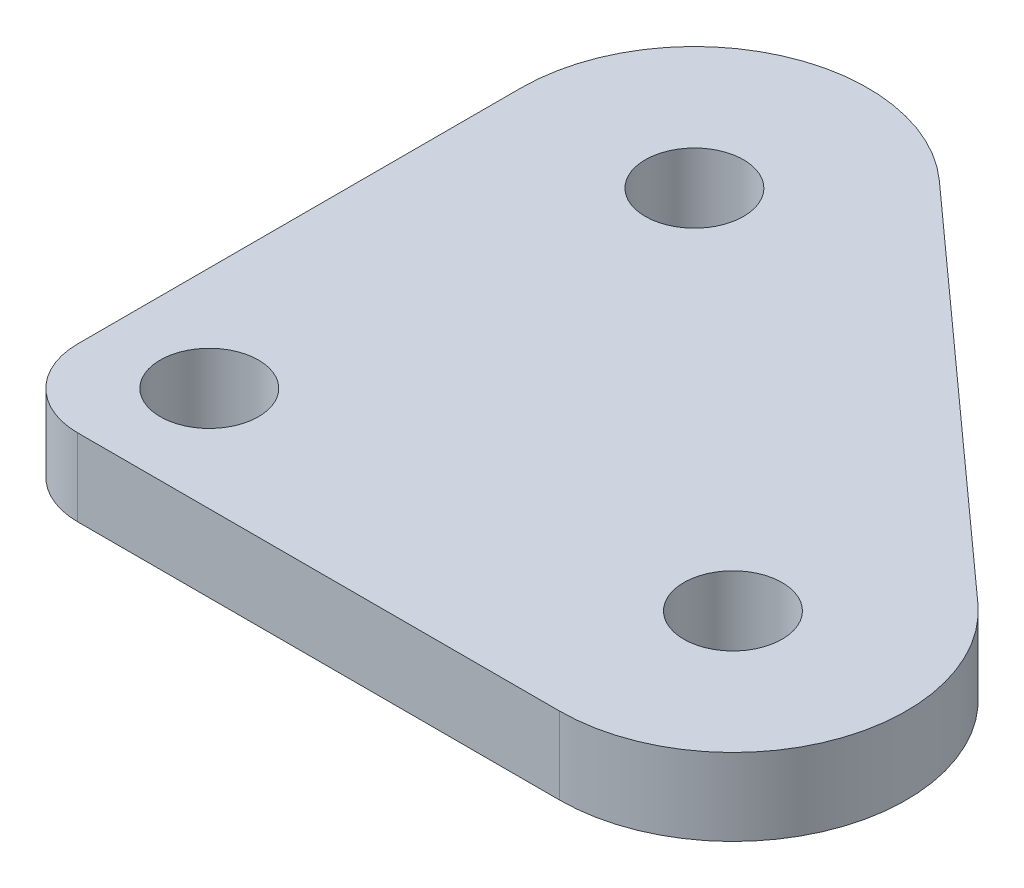
ISO-10303-21;
HEADER;
FILE_DESCRIPTION(('STEP AP214'),'2;1');
FILE_NAME('part.step','',(''),(''),'','','');
FILE_SCHEMA(('AUTOMOTIVE_DESIGN { 1 0 10303 214 1 1 1 1 }'));
ENDSEC;
DATA;
#1=APPLICATION_CONTEXT('core data for automotive mechanical design processes');
#2=APPLICATION_PROTOCOL_DEFINITION('international standard','automotive_design',2000,#1);
#3=PRODUCT_CONTEXT('',#1,'mechanical');
#4=PRODUCT('Part','Part','',(#3));
#5=PRODUCT_RELATED_PRODUCT_CATEGORY('part','',(#4));
#6=PRODUCT_DEFINITION_FORMATION('','',#4);
#7=PRODUCT_DEFINITION_CONTEXT('part definition',#1,'design');
#8=PRODUCT_DEFINITION('design','',#6,#7);
#9=PRODUCT_DEFINITION_SHAPE('','',#8);
#10=(LENGTH_UNIT() NAMED_UNIT(*) SI_UNIT(.MILLI.,.METRE.));
#11=(NAMED_UNIT(*) PLANE_ANGLE_UNIT() SI_UNIT($,.RADIAN.));
#12=(NAMED_UNIT(*) SI_UNIT($,.STERADIAN.) SOLID_ANGLE_UNIT());
#13=UNCERTAINTY_MEASURE_WITH_UNIT(LENGTH_MEASURE(1.E-05),#10,'distance_accuracy_value','');
#14=(GEOMETRIC_REPRESENTATION_CONTEXT(3) GLOBAL_UNCERTAINTY_ASSIGNED_CONTEXT((#13)) GLOBAL_UNIT_ASSIGNED_CONTEXT((#10,
#11,#12)) REPRESENTATION_CONTEXT('',''));
#15=CARTESIAN_POINT('',(0.,0.,0.));
#16=DIRECTION('',(0.,0.,1.));
#17=DIRECTION('',(1.,0.,0.));
#18=AXIS2_PLACEMENT_3D('',#15,#16,#17);
#19=CARTESIAN_POINT('',(20.,4.,0.));
#20=DIRECTION('',(0.,-1.,0.));
#21=DIRECTION('',(0.,0.,-1.));
#22=AXIS2_PLACEMENT_3D('',#19,#20,#21);
#23=CYLINDRICAL_SURFACE('',#22,9.);
#24=CARTESIAN_POINT('',(20.,0.,0.));
#25=DIRECTION('',(0.,1.,0.));
#26=DIRECTION('',(0.,0.,1.));
#27=AXIS2_PLACEMENT_3D('',#24,#25,#26);
#28=CIRCLE('',#27,9.);
#29=CARTESIAN_POINT('',(20.,0.,9.));
#30=VERTEX_POINT('',#29);
#31=CARTESIAN_POINT('',(26.020682584602,0.,-6.6896473162245));
#32=VERTEX_POINT('',#31);
#33=EDGE_CURVE('E107',#30,#32,#28,.T.);
#34=ORIENTED_EDGE('',*,*,#33,.T.);
#35=DIRECTION('',(0.,-1.,0.));
#36=VECTOR('',#35,1.);
#37=CARTESIAN_POINT('',(26.020682584602,4.,-6.6896473162245));
#38=LINE('',#37,#36);
#39=CARTESIAN_POINT('',(26.020682584602,4.,-6.6896473162245));
#40=VERTEX_POINT('',#39);
#41=EDGE_CURVE('E105',#40,#32,#38,.T.);
#42=ORIENTED_EDGE('',*,*,#41,.F.);
#43=CARTESIAN_POINT('',(20.,4.,0.));
#44=DIRECTION('',(0.,1.,0.));
#45=DIRECTION('',(0.,0.,1.));
#46=AXIS2_PLACEMENT_3D('',#43,#44,#45);
#47=CIRCLE('',#46,9.);
#48=CARTESIAN_POINT('',(20.,4.,9.));
#49=VERTEX_POINT('',#48);
#50=EDGE_CURVE('E92',#49,#40,#47,.T.);
#51=ORIENTED_EDGE('',*,*,#50,.F.);
#52=DIRECTION('',(0.,-1.,0.));
#53=VECTOR('',#52,1.);
#54=CARTESIAN_POINT('',(20.,4.,9.));
#55=LINE('',#54,#53);
#56=EDGE_CURVE('E127',#49,#30,#55,.T.);
#57=ORIENTED_EDGE('',*,*,#56,.T.);
#58=EDGE_LOOP('',(#34,#42,#51,#57));
#59=FACE_BOUND('',#58,.T.);
#60=ADVANCED_FACE('F40',(#59),#23,.T.);
#61=CARTESIAN_POINT('',(14.970958827696,4.,-16.63439869744));
#62=DIRECTION('',(0.66896473162245,0.,-0.743294146247166));
#63=DIRECTION('',(-0.743294146247166,0.,-0.66896473162245));
#64=AXIS2_PLACEMENT_3D('',#61,#62,#63);
#65=PLANE('',#64);
#66=DIRECTION('',(0.743294146247166,0.,0.66896473162245));
#67=VECTOR('',#66,1.);
#68=CARTESIAN_POINT('',(14.970958827696,0.,-16.63439869744));
#69=LINE('',#68,#67);
#70=CARTESIAN_POINT('',(6.02068258460205,0.,-24.6896473162245));
#71=VERTEX_POINT('',#70);
#72=EDGE_CURVE('E133',#71,#32,#69,.T.);
#73=ORIENTED_EDGE('',*,*,#72,.F.);
#74=DIRECTION('',(0.,-1.,0.));
#75=VECTOR('',#74,1.);
#76=CARTESIAN_POINT('',(6.02068258460205,4.,-24.6896473162245));
#77=LINE('',#76,#75);
#78=CARTESIAN_POINT('',(6.02068258460205,4.,-24.6896473162245));
#79=VERTEX_POINT('',#78);
#80=EDGE_CURVE('E112',#79,#71,#77,.T.);
#81=ORIENTED_EDGE('',*,*,#80,.F.);
#82=DIRECTION('',(0.743294146247166,0.,0.66896473162245));
#83=VECTOR('',#82,1.);
#84=CARTESIAN_POINT('',(14.970958827696,4.,-16.63439869744));
#85=LINE('',#84,#83);
#86=EDGE_CURVE('E98',#79,#40,#85,.T.);
#87=ORIENTED_EDGE('',*,*,#86,.T.);
#88=ORIENTED_EDGE('',*,*,#41,.T.);
#89=EDGE_LOOP('',(#73,#81,#87,#88));
#90=FACE_BOUND('',#89,.T.);
#91=ADVANCED_FACE('F114',(#90),#65,.T.);
#92=CARTESIAN_POINT('',(0.,4.,-18.));
#93=DIRECTION('',(0.,-1.,0.));
#94=DIRECTION('',(0.,0.,-1.));
#95=AXIS2_PLACEMENT_3D('',#92,#93,#94);
#96=CYLINDRICAL_SURFACE('',#95,9.);
#97=CARTESIAN_POINT('',(0.,0.,-18.));
#98=DIRECTION('',(0.,1.,0.));
#99=DIRECTION('',(0.,0.,1.));
#100=AXIS2_PLACEMENT_3D('',#97,#98,#99);
#101=CIRCLE('',#100,9.);
#102=CARTESIAN_POINT('',(-9.,0.,-18.));
#103=VERTEX_POINT('',#102);
#104=EDGE_CURVE('E135',#71,#103,#101,.T.);
#105=ORIENTED_EDGE('',*,*,#104,.T.);
#106=DIRECTION('',(0.,-1.,0.));
#107=VECTOR('',#106,1.);
#108=CARTESIAN_POINT('',(-9.,4.,-18.));
#109=LINE('',#108,#107);
#110=CARTESIAN_POINT('',(-9.,4.,-18.));
#111=VERTEX_POINT('',#110);
#112=EDGE_CURVE('E146',#111,#103,#109,.T.);
#113=ORIENTED_EDGE('',*,*,#112,.F.);
#114=CARTESIAN_POINT('',(0.,4.,-18.));
#115=DIRECTION('',(0.,1.,0.));
#116=DIRECTION('',(0.,0.,1.));
#117=AXIS2_PLACEMENT_3D('',#114,#115,#116);
#118=CIRCLE('',#117,9.);
#119=EDGE_CURVE('E116',#79,#111,#118,.T.);
#120=ORIENTED_EDGE('',*,*,#119,.F.);
#121=ORIENTED_EDGE('',*,*,#80,.T.);
#122=EDGE_LOOP('',(#105,#113,#120,#121));
#123=FACE_BOUND('',#122,.T.);
#124=ADVANCED_FACE('F163',(#123),#96,.T.);
#125=CARTESIAN_POINT('',(-9.,4.,0.));
#126=DIRECTION('',(-1.,0.,0.));
#127=DIRECTION('',(0.,0.,1.));
#128=AXIS2_PLACEMENT_3D('',#125,#126,#127);
#129=PLANE('',#128);
#130=DIRECTION('',(0.,0.,-1.));
#131=VECTOR('',#130,1.);
#132=CARTESIAN_POINT('',(-9.,0.,0.));
#133=LINE('',#132,#131);
#134=CARTESIAN_POINT('',(-9.,0.,5.));
#135=VERTEX_POINT('',#134);
#136=EDGE_CURVE('E138',#135,#103,#133,.T.);
#137=ORIENTED_EDGE('',*,*,#136,.F.);
#138=DIRECTION('',(0.,-1.,0.));
#139=VECTOR('',#138,1.);
#140=CARTESIAN_POINT('',(-9.,4.,5.));
#141=LINE('',#140,#139);
#142=CARTESIAN_POINT('',(-9.,4.,5.));
#143=VERTEX_POINT('',#142);
#144=EDGE_CURVE('E48',#135,#143,#141,.F.);
#145=ORIENTED_EDGE('',*,*,#144,.T.);
#146=DIRECTION('',(0.,0.,-1.));
#147=VECTOR('',#146,1.);
#148=CARTESIAN_POINT('',(-9.,4.,0.));
#149=LINE('',#148,#147);
#150=EDGE_CURVE('E118',#143,#111,#149,.T.);
#151=ORIENTED_EDGE('',*,*,#150,.T.);
#152=ORIENTED_EDGE('',*,*,#112,.T.);
#153=EDGE_LOOP('',(#137,#145,#151,#152));
#154=FACE_BOUND('',#153,.T.);
#155=ADVANCED_FACE('F191',(#154),#129,.T.);
#156=CARTESIAN_POINT('',(0.,4.,9.));
#157=DIRECTION('',(0.,0.,1.));
#158=DIRECTION('',(1.,0.,0.));
#159=AXIS2_PLACEMENT_3D('',#156,#157,#158);
#160=PLANE('',#159);
#161=DIRECTION('',(-1.,0.,0.));
#162=VECTOR('',#161,1.);
#163=CARTESIAN_POINT('',(0.,4.,9.));
#164=LINE('',#163,#162);
#165=CARTESIAN_POINT('',(-5.,4.,9.));
#166=VERTEX_POINT('',#165);
#167=EDGE_CURVE('E100',#49,#166,#164,.T.);
#168=ORIENTED_EDGE('',*,*,#167,.T.);
#169=DIRECTION('',(0.,-1.,0.));
#170=VECTOR('',#169,1.);
#171=CARTESIAN_POINT('',(-5.,4.,9.));
#172=LINE('',#171,#170);
#173=CARTESIAN_POINT('',(-5.,0.,9.));
#174=VERTEX_POINT('',#173);
#175=EDGE_CURVE('E111',#166,#174,#172,.T.);
#176=ORIENTED_EDGE('',*,*,#175,.T.);
#177=DIRECTION('',(-1.,0.,0.));
#178=VECTOR('',#177,1.);
#179=CARTESIAN_POINT('',(0.,0.,9.));
#180=LINE('',#179,#178);
#181=EDGE_CURVE('E140',#30,#174,#180,.T.);
#182=ORIENTED_EDGE('',*,*,#181,.F.);
#183=ORIENTED_EDGE('',*,*,#56,.F.);
#184=EDGE_LOOP('',(#168,#176,#182,#183));
#185=FACE_BOUND('',#184,.T.);
#186=ADVANCED_FACE('F155',(#185),#160,.T.);
#187=CARTESIAN_POINT('',(20.,4.,0.));
#188=DIRECTION('',(0.,-1.,0.));
#189=DIRECTION('',(0.,0.,-1.));
#190=AXIS2_PLACEMENT_3D('',#187,#188,#189);
#191=CYLINDRICAL_SURFACE('',#190,2.55);
#192=CARTESIAN_POINT('',(20.,4.,0.));
#193=DIRECTION('',(0.,1.,0.));
#194=DIRECTION('',(0.,0.,1.));
#195=AXIS2_PLACEMENT_3D('',#192,#193,#194);
#196=CIRCLE('',#195,2.55);
#197=CARTESIAN_POINT('',(20.,4.,2.55));
#198=VERTEX_POINT('',#197);
#199=EDGE_CURVE('E102',#198,#198,#196,.T.);
#200=ORIENTED_EDGE('',*,*,#199,.T.);
#201=EDGE_LOOP('',(#200));
#202=FACE_BOUND('',#201,.T.);
#203=CARTESIAN_POINT('',(20.,0.,0.));
#204=DIRECTION('',(0.,1.,0.));
#205=DIRECTION('',(0.,0.,1.));
#206=AXIS2_PLACEMENT_3D('',#203,#204,#205);
#207=CIRCLE('',#206,2.55);
#208=CARTESIAN_POINT('',(20.,0.,2.55));
#209=VERTEX_POINT('',#208);
#210=EDGE_CURVE('E128',#209,#209,#207,.T.);
#211=ORIENTED_EDGE('',*,*,#210,.F.);
#212=EDGE_LOOP('',(#211));
#213=FACE_BOUND('',#212,.T.);
#214=ADVANCED_FACE('F181',(#202,#213),#191,.F.);
#215=CARTESIAN_POINT('',(0.,4.,-18.));
#216=DIRECTION('',(0.,-1.,0.));
#217=DIRECTION('',(0.,0.,-1.));
#218=AXIS2_PLACEMENT_3D('',#215,#216,#217);
#219=CYLINDRICAL_SURFACE('',#218,2.55);
#220=CARTESIAN_POINT('',(0.,4.,-18.));
#221=DIRECTION('',(0.,1.,0.));
#222=DIRECTION('',(0.,0.,1.));
#223=AXIS2_PLACEMENT_3D('',#220,#221,#222);
#224=CIRCLE('',#223,2.55);
#225=CARTESIAN_POINT('',(0.,4.,-15.45));
#226=VERTEX_POINT('',#225);
#227=EDGE_CURVE('E124',#226,#226,#224,.T.);
#228=ORIENTED_EDGE('',*,*,#227,.T.);
#229=EDGE_LOOP('',(#228));
#230=FACE_BOUND('',#229,.T.);
#231=CARTESIAN_POINT('',(0.,0.,-18.));
#232=DIRECTION('',(0.,1.,0.));
#233=DIRECTION('',(0.,0.,1.));
#234=AXIS2_PLACEMENT_3D('',#231,#232,#233);
#235=CIRCLE('',#234,2.55);
#236=CARTESIAN_POINT('',(0.,0.,-15.45));
#237=VERTEX_POINT('',#236);
#238=EDGE_CURVE('E142',#237,#237,#235,.T.);
#239=ORIENTED_EDGE('',*,*,#238,.F.);
#240=EDGE_LOOP('',(#239));
#241=FACE_BOUND('',#240,.T.);
#242=ADVANCED_FACE('F183',(#230,#241),#219,.F.);
#243=CARTESIAN_POINT('',(0.,4.,0.));
#244=DIRECTION('',(0.,1.,0.));
#245=DIRECTION('',(0.,0.,1.));
#246=AXIS2_PLACEMENT_3D('',#243,#244,#245);
#247=PLANE('',#246);
#248=CARTESIAN_POINT('',(-3.5857864376269,4.,3.5857864376269));
#249=DIRECTION('',(0.,-1.,0.));
#250=DIRECTION('',(0.,0.,-1.));
#251=AXIS2_PLACEMENT_3D('',#248,#249,#250);
#252=CIRCLE('',#251,2.55);
#253=CARTESIAN_POINT('',(-3.5857864376269,4.,1.0357864376269));
#254=VERTEX_POINT('',#253);
#255=EDGE_CURVE('E131',#254,#254,#252,.T.);
#256=ORIENTED_EDGE('',*,*,#255,.T.);
#257=EDGE_LOOP('',(#256));
#258=FACE_BOUND('',#257,.T.);
#259=ORIENTED_EDGE('',*,*,#199,.F.);
#260=EDGE_LOOP('',(#259));
#261=FACE_BOUND('',#260,.T.);
#262=ORIENTED_EDGE('',*,*,#150,.F.);
#263=CARTESIAN_POINT('',(-5.,4.,5.));
#264=DIRECTION('',(0.,1.,0.));
#265=DIRECTION('',(0.,0.,1.));
#266=AXIS2_PLACEMENT_3D('',#263,#264,#265);
#267=CIRCLE('',#266,4.);
#268=EDGE_CURVE('E11',#143,#166,#267,.T.);
#269=ORIENTED_EDGE('',*,*,#268,.T.);
#270=ORIENTED_EDGE('',*,*,#167,.F.);
#271=ORIENTED_EDGE('',*,*,#50,.T.);
#272=ORIENTED_EDGE('',*,*,#86,.F.);
#273=ORIENTED_EDGE('',*,*,#119,.T.);
#274=EDGE_LOOP('',(#262,#269,#270,#271,#272,#273));
#275=FACE_BOUND('',#274,.T.);
#276=ORIENTED_EDGE('',*,*,#227,.F.);
#277=EDGE_LOOP('',(#276));
#278=FACE_BOUND('',#277,.T.);
#279=ADVANCED_FACE('F94',(#258,#261,#275,#278),#247,.T.);
#280=CARTESIAN_POINT('',(0.,0.,0.));
#281=DIRECTION('',(0.,1.,0.));
#282=DIRECTION('',(0.,0.,1.));
#283=AXIS2_PLACEMENT_3D('',#280,#281,#282);
#284=PLANE('',#283);
#285=CARTESIAN_POINT('',(-3.5857864376269,0.,3.5857864376269));
#286=DIRECTION('',(0.,-1.,0.));
#287=DIRECTION('',(0.,0.,-1.));
#288=AXIS2_PLACEMENT_3D('',#285,#286,#287);
#289=CIRCLE('',#288,2.55);
#290=CARTESIAN_POINT('',(-3.5857864376269,0.,1.0357864376269));
#291=VERTEX_POINT('',#290);
#292=EDGE_CURVE('E200',#291,#291,#289,.T.);
#293=ORIENTED_EDGE('',*,*,#292,.F.);
#294=EDGE_LOOP('',(#293));
#295=FACE_BOUND('',#294,.T.);
#296=ORIENTED_EDGE('',*,*,#210,.T.);
#297=EDGE_LOOP('',(#296));
#298=FACE_BOUND('',#297,.T.);
#299=ORIENTED_EDGE('',*,*,#181,.T.);
#300=CARTESIAN_POINT('',(-5.,0.,5.));
#301=DIRECTION('',(0.,1.,0.));
#302=DIRECTION('',(0.,0.,1.));
#303=AXIS2_PLACEMENT_3D('',#300,#301,#302);
#304=CIRCLE('',#303,4.);
#305=EDGE_CURVE('E62',#174,#135,#304,.F.);
#306=ORIENTED_EDGE('',*,*,#305,.T.);
#307=ORIENTED_EDGE('',*,*,#136,.T.);
#308=ORIENTED_EDGE('',*,*,#104,.F.);
#309=ORIENTED_EDGE('',*,*,#72,.T.);
#310=ORIENTED_EDGE('',*,*,#33,.F.);
#311=EDGE_LOOP('',(#299,#306,#307,#308,#309,#310));
#312=FACE_BOUND('',#311,.T.);
#313=ORIENTED_EDGE('',*,*,#238,.T.);
#314=EDGE_LOOP('',(#313));
#315=FACE_BOUND('',#314,.T.);
#316=ADVANCED_FACE('F158',(#295,#298,#312,#315),#284,.F.);
#317=CARTESIAN_POINT('',(-5.,4.,5.));
#318=DIRECTION('',(0.,-1.,0.));
#319=DIRECTION('',(0.,0.,-1.));
#320=AXIS2_PLACEMENT_3D('',#317,#318,#319);
#321=CYLINDRICAL_SURFACE('',#320,4.);
#322=ORIENTED_EDGE('',*,*,#268,.F.);
#323=ORIENTED_EDGE('',*,*,#144,.F.);
#324=ORIENTED_EDGE('',*,*,#305,.F.);
#325=ORIENTED_EDGE('',*,*,#175,.F.);
#326=EDGE_LOOP('',(#322,#323,#324,#325));
#327=FACE_BOUND('',#326,.T.);
#328=ADVANCED_FACE('F42',(#327),#321,.T.);
#329=CARTESIAN_POINT('',(-3.5857864376269,4.,3.5857864376269));
#330=DIRECTION('',(0.,-1.,0.));
#331=DIRECTION('',(0.,0.,-1.));
#332=AXIS2_PLACEMENT_3D('',#329,#330,#331);
#333=CYLINDRICAL_SURFACE('',#332,2.55);
#334=ORIENTED_EDGE('',*,*,#255,.F.);
#335=EDGE_LOOP('',(#334));
#336=FACE_BOUND('',#335,.T.);
#337=ORIENTED_EDGE('',*,*,#292,.T.);
#338=EDGE_LOOP('',(#337));
#339=FACE_BOUND('',#338,.T.);
#340=ADVANCED_FACE('F165',(#336,#339),#333,.F.);
#341=CLOSED_SHELL('',(#60,#91,#124,#155,#186,#214,#242,#279,#316,#328,#340));
#342=MANIFOLD_SOLID_BREP('B2',#341);
#343=ADVANCED_BREP_SHAPE_REPRESENTATION('',(#18,#342),#14);
#344=SHAPE_DEFINITION_REPRESENTATION(#9,#343);
ENDSEC;
END-ISO-10303-21;
